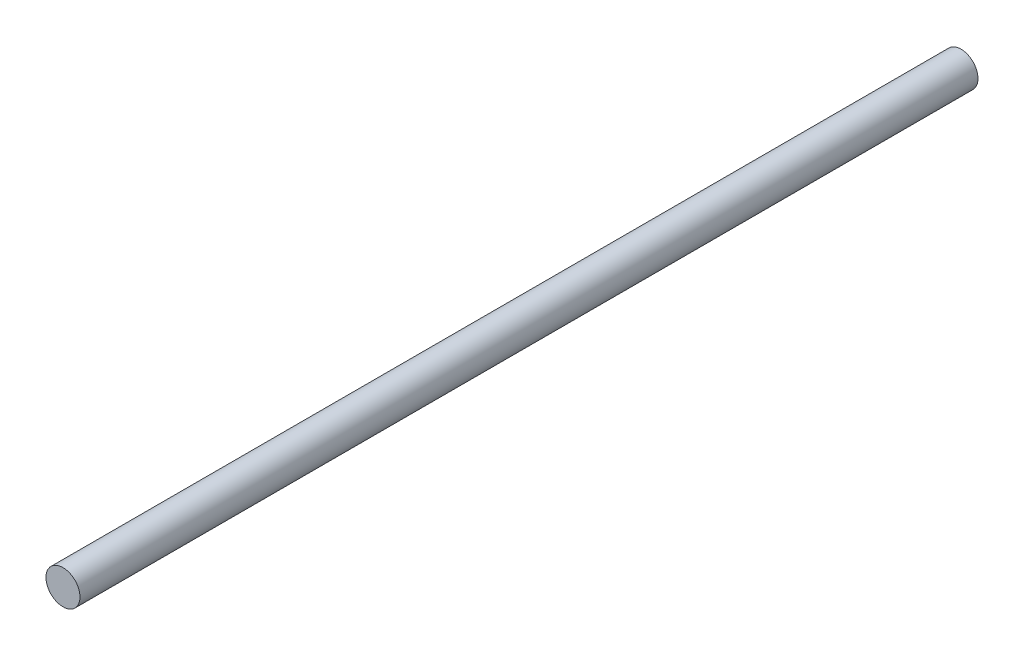
ISO-10303-21;
HEADER;
FILE_DESCRIPTION(('STEP AP214'),'2;1');
FILE_NAME('part.step','',(''),(''),'','','');
FILE_SCHEMA(('AUTOMOTIVE_DESIGN { 1 0 10303 214 1 1 1 1 }'));
ENDSEC;
DATA;
#1=APPLICATION_CONTEXT('core data for automotive mechanical design processes');
#2=APPLICATION_PROTOCOL_DEFINITION('international standard','automotive_design',2000,#1);
#3=PRODUCT_CONTEXT('',#1,'mechanical');
#4=PRODUCT('Part','Part','',(#3));
#5=PRODUCT_RELATED_PRODUCT_CATEGORY('part','',(#4));
#6=PRODUCT_DEFINITION_FORMATION('','',#4);
#7=PRODUCT_DEFINITION_CONTEXT('part definition',#1,'design');
#8=PRODUCT_DEFINITION('design','',#6,#7);
#9=PRODUCT_DEFINITION_SHAPE('','',#8);
#10=(LENGTH_UNIT() NAMED_UNIT(*) SI_UNIT(.MILLI.,.METRE.));
#11=(NAMED_UNIT(*) PLANE_ANGLE_UNIT() SI_UNIT($,.RADIAN.));
#12=(NAMED_UNIT(*) SI_UNIT($,.STERADIAN.) SOLID_ANGLE_UNIT());
#13=UNCERTAINTY_MEASURE_WITH_UNIT(LENGTH_MEASURE(1.E-05),#10,'distance_accuracy_value','');
#14=(GEOMETRIC_REPRESENTATION_CONTEXT(3) GLOBAL_UNCERTAINTY_ASSIGNED_CONTEXT((#13)) GLOBAL_UNIT_ASSIGNED_CONTEXT((#10,
#11,#12)) REPRESENTATION_CONTEXT('',''));
#15=CARTESIAN_POINT('',(0.,0.,0.));
#16=DIRECTION('',(0.,0.,1.));
#17=DIRECTION('',(1.,0.,0.));
#18=AXIS2_PLACEMENT_3D('',#15,#16,#17);
#19=CARTESIAN_POINT('',(0.,0.,264.));
#20=DIRECTION('',(0.,0.,-1.));
#21=DIRECTION('',(-1.,0.,0.));
#22=AXIS2_PLACEMENT_3D('',#19,#20,#21);
#23=CYLINDRICAL_SURFACE('',#22,5.);
#24=CARTESIAN_POINT('',(0.,0.,264.));
#25=DIRECTION('',(0.,0.,1.));
#26=DIRECTION('',(1.,0.,0.));
#27=AXIS2_PLACEMENT_3D('',#24,#25,#26);
#28=CIRCLE('',#27,5.);
#29=CARTESIAN_POINT('',(5.,0.,264.));
#30=VERTEX_POINT('',#29);
#31=EDGE_CURVE('E10',#30,#30,#28,.T.);
#32=ORIENTED_EDGE('',*,*,#31,.F.);
#33=EDGE_LOOP('',(#32));
#34=FACE_BOUND('',#33,.T.);
#35=CARTESIAN_POINT('',(0.,0.,0.));
#36=DIRECTION('',(0.,0.,1.));
#37=DIRECTION('',(1.,0.,0.));
#38=AXIS2_PLACEMENT_3D('',#35,#36,#37);
#39=CIRCLE('',#38,5.);
#40=CARTESIAN_POINT('',(5.,0.,0.));
#41=VERTEX_POINT('',#40);
#42=EDGE_CURVE('E33',#41,#41,#39,.T.);
#43=ORIENTED_EDGE('',*,*,#42,.T.);
#44=EDGE_LOOP('',(#43));
#45=FACE_BOUND('',#44,.T.);
#46=ADVANCED_FACE('F30',(#34,#45),#23,.T.);
#47=CARTESIAN_POINT('',(0.,0.,264.));
#48=DIRECTION('',(0.,0.,1.));
#49=DIRECTION('',(1.,0.,0.));
#50=AXIS2_PLACEMENT_3D('',#47,#48,#49);
#51=PLANE('',#50);
#52=ORIENTED_EDGE('',*,*,#31,.T.);
#53=EDGE_LOOP('',(#52));
#54=FACE_BOUND('',#53,.T.);
#55=ADVANCED_FACE('F45',(#54),#51,.T.);
#56=CARTESIAN_POINT('',(0.,0.,0.));
#57=DIRECTION('',(0.,0.,1.));
#58=DIRECTION('',(1.,0.,0.));
#59=AXIS2_PLACEMENT_3D('',#56,#57,#58);
#60=PLANE('',#59);
#61=ORIENTED_EDGE('',*,*,#42,.F.);
#62=EDGE_LOOP('',(#61));
#63=FACE_BOUND('',#62,.T.);
#64=ADVANCED_FACE('F43',(#63),#60,.F.);
#65=CLOSED_SHELL('',(#46,#55,#64));
#66=MANIFOLD_SOLID_BREP('B2',#65);
#67=ADVANCED_BREP_SHAPE_REPRESENTATION('',(#18,#66),#14);
#68=SHAPE_DEFINITION_REPRESENTATION(#9,#67);
ENDSEC;
END-ISO-10303-21;
